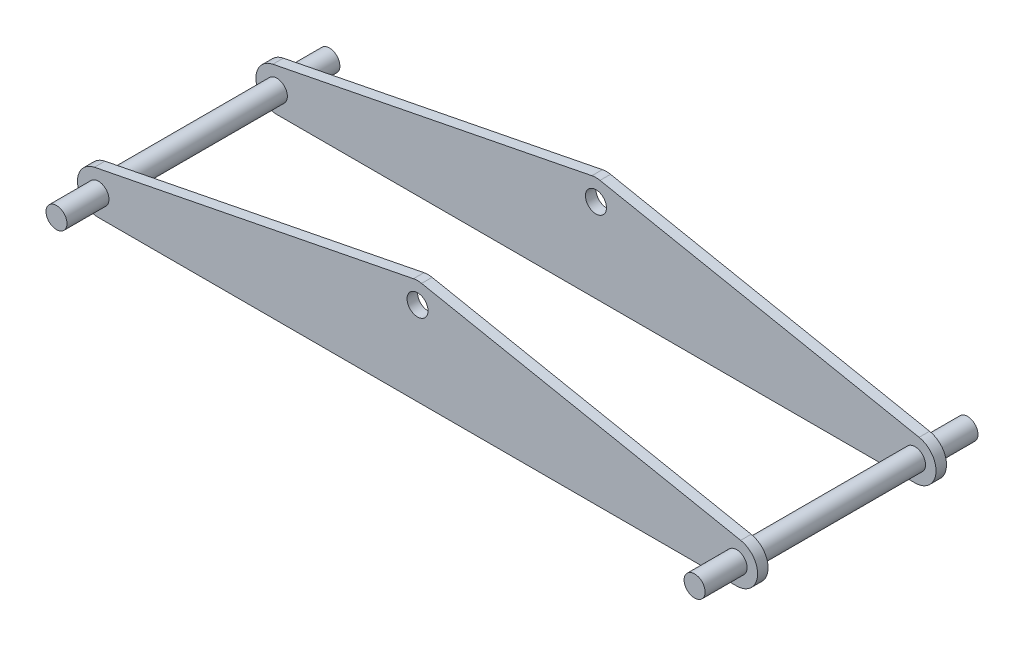
ISO-10303-21;
HEADER;
FILE_DESCRIPTION(('STEP AP214'),'2;1');
FILE_NAME('part.step','',(''),(''),'','','');
FILE_SCHEMA(('AUTOMOTIVE_DESIGN { 1 0 10303 214 1 1 1 1 }'));
ENDSEC;
DATA;
#1=APPLICATION_CONTEXT('core data for automotive mechanical design processes');
#2=APPLICATION_PROTOCOL_DEFINITION('international standard','automotive_design',2000,#1);
#3=PRODUCT_CONTEXT('',#1,'mechanical');
#4=PRODUCT('Part','Part','',(#3));
#5=PRODUCT_RELATED_PRODUCT_CATEGORY('part','',(#4));
#6=PRODUCT_DEFINITION_FORMATION('','',#4);
#7=PRODUCT_DEFINITION_CONTEXT('part definition',#1,'design');
#8=PRODUCT_DEFINITION('design','',#6,#7);
#9=PRODUCT_DEFINITION_SHAPE('','',#8);
#10=(LENGTH_UNIT() NAMED_UNIT(*) SI_UNIT(.MILLI.,.METRE.));
#11=(NAMED_UNIT(*) PLANE_ANGLE_UNIT() SI_UNIT($,.RADIAN.));
#12=(NAMED_UNIT(*) SI_UNIT($,.STERADIAN.) SOLID_ANGLE_UNIT());
#13=UNCERTAINTY_MEASURE_WITH_UNIT(LENGTH_MEASURE(1.E-05),#10,'distance_accuracy_value','');
#14=(GEOMETRIC_REPRESENTATION_CONTEXT(3) GLOBAL_UNCERTAINTY_ASSIGNED_CONTEXT((#13)) GLOBAL_UNIT_ASSIGNED_CONTEXT((#10,
#11,#12)) REPRESENTATION_CONTEXT('',''));
#15=CARTESIAN_POINT('',(0.,0.,0.));
#16=DIRECTION('',(0.,0.,1.));
#17=DIRECTION('',(1.,0.,0.));
#18=AXIS2_PLACEMENT_3D('',#15,#16,#17);
#19=CARTESIAN_POINT('',(-965.2,0.,-555.625));
#20=DIRECTION('',(0.,0.,-1.));
#21=DIRECTION('',(-1.,0.,0.));
#22=AXIS2_PLACEMENT_3D('',#19,#20,#21);
#23=PLANE('',#22);
#24=CARTESIAN_POINT('',(-965.2,0.,-555.625));
#25=DIRECTION('',(0.,0.,-1.));
#26=DIRECTION('',(-1.,0.,0.));
#27=AXIS2_PLACEMENT_3D('',#24,#25,#26);
#28=CIRCLE('',#27,31.75);
#29=CARTESIAN_POINT('',(-996.95,0.,-555.625));
#30=VERTEX_POINT('',#29);
#31=EDGE_CURVE('E193',#30,#30,#28,.T.);
#32=ORIENTED_EDGE('',*,*,#31,.F.);
#33=EDGE_LOOP('',(#32));
#34=FACE_BOUND('',#33,.T.);
#35=CARTESIAN_POINT('',(-965.2,0.,-555.625));
#36=DIRECTION('',(0.,0.,-1.));
#37=DIRECTION('',(-1.,0.,0.));
#38=AXIS2_PLACEMENT_3D('',#35,#36,#37);
#39=CIRCLE('',#38,63.5);
#40=CARTESIAN_POINT('',(-965.2,-63.5,-555.625));
#41=VERTEX_POINT('',#40);
#42=CARTESIAN_POINT('',(-977.495697525438,62.2982007955522,-555.625));
#43=VERTEX_POINT('',#42);
#44=EDGE_CURVE('E138',#41,#43,#39,.T.);
#45=ORIENTED_EDGE('',*,*,#44,.T.);
#46=DIRECTION('',(0.981074028276412,0.193633031896661,0.));
#47=VECTOR('',#46,1.);
#48=CARTESIAN_POINT('',(-977.495697525438,62.2982007955522,-555.625));
#49=LINE('',#48,#47);
#50=CARTESIAN_POINT('',(-12.2956975254381,252.798200795553,-555.625));
#51=VERTEX_POINT('',#50);
#52=EDGE_CURVE('E96',#43,#51,#49,.T.);
#53=ORIENTED_EDGE('',*,*,#52,.T.);
#54=CARTESIAN_POINT('',(-2.09296820237771E-12,190.5,-555.625));
#55=DIRECTION('',(0.,0.,-1.));
#56=DIRECTION('',(-1.,0.,0.));
#57=AXIS2_PLACEMENT_3D('',#54,#55,#56);
#58=CIRCLE('',#57,63.5000000000002);
#59=CARTESIAN_POINT('',(12.2956975254379,252.798200795552,-555.625));
#60=VERTEX_POINT('',#59);
#61=EDGE_CURVE('E109',#51,#60,#58,.T.);
#62=ORIENTED_EDGE('',*,*,#61,.T.);
#63=DIRECTION('',(0.981074028276413,-0.19363303189666,0.));
#64=VECTOR('',#63,1.);
#65=CARTESIAN_POINT('',(12.2956975254379,252.798200795552,-555.625));
#66=LINE('',#65,#64);
#67=CARTESIAN_POINT('',(977.495697525438,62.2982007955522,-555.625));
#68=VERTEX_POINT('',#67);
#69=EDGE_CURVE('E103',#60,#68,#66,.T.);
#70=ORIENTED_EDGE('',*,*,#69,.T.);
#71=CARTESIAN_POINT('',(965.2,0.,-555.625));
#72=DIRECTION('',(0.,0.,-1.));
#73=DIRECTION('',(-1.,0.,0.));
#74=AXIS2_PLACEMENT_3D('',#71,#72,#73);
#75=CIRCLE('',#74,63.5);
#76=CARTESIAN_POINT('',(965.2,-63.5,-555.625));
#77=VERTEX_POINT('',#76);
#78=EDGE_CURVE('E107',#68,#77,#75,.T.);
#79=ORIENTED_EDGE('',*,*,#78,.T.);
#80=DIRECTION('',(-1.,0.,0.));
#81=VECTOR('',#80,1.);
#82=CARTESIAN_POINT('',(965.2,-63.5,-555.625));
#83=LINE('',#82,#81);
#84=EDGE_CURVE('E59',#77,#41,#83,.T.);
#85=ORIENTED_EDGE('',*,*,#84,.T.);
#86=EDGE_LOOP('',(#45,#53,#62,#70,#79,#85));
#87=FACE_BOUND('',#86,.T.);
#88=CARTESIAN_POINT('',(0.,190.5,-555.625));
#89=DIRECTION('',(0.,0.,-1.));
#90=DIRECTION('',(-1.,0.,0.));
#91=AXIS2_PLACEMENT_3D('',#88,#89,#90);
#92=CIRCLE('',#91,31.75);
#93=CARTESIAN_POINT('',(-31.75,190.5,-555.625));
#94=VERTEX_POINT('',#93);
#95=EDGE_CURVE('E131',#94,#94,#92,.T.);
#96=ORIENTED_EDGE('',*,*,#95,.F.);
#97=EDGE_LOOP('',(#96));
#98=FACE_BOUND('',#97,.T.);
#99=CARTESIAN_POINT('',(965.2,0.,-555.625));
#100=DIRECTION('',(0.,0.,-1.));
#101=DIRECTION('',(-1.,0.,0.));
#102=AXIS2_PLACEMENT_3D('',#99,#100,#101);
#103=CIRCLE('',#102,31.75);
#104=CARTESIAN_POINT('',(933.45,0.,-555.625));
#105=VERTEX_POINT('',#104);
#106=EDGE_CURVE('E184',#105,#105,#103,.T.);
#107=ORIENTED_EDGE('',*,*,#106,.F.);
#108=EDGE_LOOP('',(#107));
#109=FACE_BOUND('',#108,.T.);
#110=ADVANCED_FACE('F42',(#34,#87,#98,#109),#23,.T.);
#111=CARTESIAN_POINT('',(-965.2,0.,-523.875));
#112=DIRECTION('',(0.,0.,-1.));
#113=DIRECTION('',(-1.,0.,0.));
#114=AXIS2_PLACEMENT_3D('',#111,#112,#113);
#115=PLANE('',#114);
#116=CARTESIAN_POINT('',(-965.2,0.,-523.875));
#117=DIRECTION('',(0.,0.,-1.));
#118=DIRECTION('',(-1.,0.,0.));
#119=AXIS2_PLACEMENT_3D('',#116,#117,#118);
#120=CIRCLE('',#119,63.5);
#121=CARTESIAN_POINT('',(-965.2,-63.5,-523.875));
#122=VERTEX_POINT('',#121);
#123=CARTESIAN_POINT('',(-977.495697525438,62.2982007955522,-523.875));
#124=VERTEX_POINT('',#123);
#125=EDGE_CURVE('E127',#122,#124,#120,.T.);
#126=ORIENTED_EDGE('',*,*,#125,.F.);
#127=DIRECTION('',(-1.,0.,0.));
#128=VECTOR('',#127,1.);
#129=CARTESIAN_POINT('',(965.2,-63.5,-523.875));
#130=LINE('',#129,#128);
#131=CARTESIAN_POINT('',(965.2,-63.5,-523.875));
#132=VERTEX_POINT('',#131);
#133=EDGE_CURVE('E88',#132,#122,#130,.T.);
#134=ORIENTED_EDGE('',*,*,#133,.F.);
#135=CARTESIAN_POINT('',(965.2,0.,-523.875));
#136=DIRECTION('',(0.,0.,-1.));
#137=DIRECTION('',(-1.,0.,0.));
#138=AXIS2_PLACEMENT_3D('',#135,#136,#137);
#139=CIRCLE('',#138,63.5);
#140=CARTESIAN_POINT('',(977.495697525438,62.2982007955522,-523.875));
#141=VERTEX_POINT('',#140);
#142=EDGE_CURVE('E82',#141,#132,#139,.T.);
#143=ORIENTED_EDGE('',*,*,#142,.F.);
#144=DIRECTION('',(0.981074028276413,-0.19363303189666,0.));
#145=VECTOR('',#144,1.);
#146=CARTESIAN_POINT('',(12.2956975254379,252.798200795552,-523.875));
#147=LINE('',#146,#145);
#148=CARTESIAN_POINT('',(12.2956975254379,252.798200795552,-523.875));
#149=VERTEX_POINT('',#148);
#150=EDGE_CURVE('E117',#149,#141,#147,.T.);
#151=ORIENTED_EDGE('',*,*,#150,.F.);
#152=CARTESIAN_POINT('',(-2.09296820237771E-12,190.5,-523.875));
#153=DIRECTION('',(0.,0.,-1.));
#154=DIRECTION('',(-1.,0.,0.));
#155=AXIS2_PLACEMENT_3D('',#152,#153,#154);
#156=CIRCLE('',#155,63.5000000000002);
#157=CARTESIAN_POINT('',(-12.2956975254381,252.798200795553,-523.875));
#158=VERTEX_POINT('',#157);
#159=EDGE_CURVE('E133',#158,#149,#156,.T.);
#160=ORIENTED_EDGE('',*,*,#159,.F.);
#161=DIRECTION('',(0.981074028276412,0.193633031896661,0.));
#162=VECTOR('',#161,1.);
#163=CARTESIAN_POINT('',(-977.495697525438,62.2982007955522,-523.875));
#164=LINE('',#163,#162);
#165=EDGE_CURVE('E130',#124,#158,#164,.T.);
#166=ORIENTED_EDGE('',*,*,#165,.F.);
#167=EDGE_LOOP('',(#126,#134,#143,#151,#160,#166));
#168=FACE_BOUND('',#167,.T.);
#169=CARTESIAN_POINT('',(0.,190.5,-523.875));
#170=DIRECTION('',(0.,0.,-1.));
#171=DIRECTION('',(-1.,0.,0.));
#172=AXIS2_PLACEMENT_3D('',#169,#170,#171);
#173=CIRCLE('',#172,31.75);
#174=CARTESIAN_POINT('',(-31.75,190.5,-523.875));
#175=VERTEX_POINT('',#174);
#176=EDGE_CURVE('E196',#175,#175,#173,.T.);
#177=ORIENTED_EDGE('',*,*,#176,.T.);
#178=EDGE_LOOP('',(#177));
#179=FACE_BOUND('',#178,.T.);
#180=CARTESIAN_POINT('',(-965.2,0.,-523.875));
#181=DIRECTION('',(0.,0.,-1.));
#182=DIRECTION('',(-1.,0.,0.));
#183=AXIS2_PLACEMENT_3D('',#180,#181,#182);
#184=CIRCLE('',#183,31.75);
#185=CARTESIAN_POINT('',(-996.95,0.,-523.875));
#186=VERTEX_POINT('',#185);
#187=EDGE_CURVE('E190',#186,#186,#184,.T.);
#188=ORIENTED_EDGE('',*,*,#187,.T.);
#189=EDGE_LOOP('',(#188));
#190=FACE_BOUND('',#189,.T.);
#191=CARTESIAN_POINT('',(965.2,0.,-523.875));
#192=DIRECTION('',(0.,0.,-1.));
#193=DIRECTION('',(-1.,0.,0.));
#194=AXIS2_PLACEMENT_3D('',#191,#192,#193);
#195=CIRCLE('',#194,31.75);
#196=CARTESIAN_POINT('',(933.45,0.,-523.875));
#197=VERTEX_POINT('',#196);
#198=EDGE_CURVE('E187',#197,#197,#195,.T.);
#199=ORIENTED_EDGE('',*,*,#198,.T.);
#200=EDGE_LOOP('',(#199));
#201=FACE_BOUND('',#200,.T.);
#202=ADVANCED_FACE('F147',(#168,#179,#190,#201),#115,.F.);
#203=CARTESIAN_POINT('',(-965.2,0.,-555.625));
#204=DIRECTION('',(0.,0.,1.));
#205=DIRECTION('',(1.,0.,0.));
#206=AXIS2_PLACEMENT_3D('',#203,#204,#205);
#207=CYLINDRICAL_SURFACE('',#206,63.5);
#208=ORIENTED_EDGE('',*,*,#125,.T.);
#209=DIRECTION('',(0.,0.,1.));
#210=VECTOR('',#209,1.);
#211=CARTESIAN_POINT('',(-977.495697525438,62.2982007955522,-555.625));
#212=LINE('',#211,#210);
#213=EDGE_CURVE('E12',#43,#124,#212,.T.);
#214=ORIENTED_EDGE('',*,*,#213,.F.);
#215=ORIENTED_EDGE('',*,*,#44,.F.);
#216=DIRECTION('',(0.,0.,1.));
#217=VECTOR('',#216,1.);
#218=CARTESIAN_POINT('',(-965.2,-63.5,-555.625));
#219=LINE('',#218,#217);
#220=EDGE_CURVE('E123',#41,#122,#219,.T.);
#221=ORIENTED_EDGE('',*,*,#220,.T.);
#222=EDGE_LOOP('',(#208,#214,#215,#221));
#223=FACE_BOUND('',#222,.T.);
#224=ADVANCED_FACE('F44',(#223),#207,.T.);
#225=CARTESIAN_POINT('',(-977.495697525438,62.2982007955522,-555.625));
#226=DIRECTION('',(0.193633031896661,-0.981074028276412,0.));
#227=DIRECTION('',(0.981074028276413,0.193633031896661,0.));
#228=AXIS2_PLACEMENT_3D('',#225,#226,#227);
#229=PLANE('',#228);
#230=ORIENTED_EDGE('',*,*,#165,.T.);
#231=DIRECTION('',(0.,0.,1.));
#232=VECTOR('',#231,1.);
#233=CARTESIAN_POINT('',(-12.2956975254381,252.798200795553,-555.625));
#234=LINE('',#233,#232);
#235=EDGE_CURVE('E51',#51,#158,#234,.T.);
#236=ORIENTED_EDGE('',*,*,#235,.F.);
#237=ORIENTED_EDGE('',*,*,#52,.F.);
#238=ORIENTED_EDGE('',*,*,#213,.T.);
#239=EDGE_LOOP('',(#230,#236,#237,#238));
#240=FACE_BOUND('',#239,.T.);
#241=ADVANCED_FACE('F246',(#240),#229,.F.);
#242=CARTESIAN_POINT('',(-2.09296820237771E-12,190.5,-555.625));
#243=DIRECTION('',(0.,0.,1.));
#244=DIRECTION('',(1.,0.,0.));
#245=AXIS2_PLACEMENT_3D('',#242,#243,#244);
#246=CYLINDRICAL_SURFACE('',#245,63.5000000000002);
#247=ORIENTED_EDGE('',*,*,#159,.T.);
#248=DIRECTION('',(0.,0.,1.));
#249=VECTOR('',#248,1.);
#250=CARTESIAN_POINT('',(12.2956975254379,252.798200795552,-555.625));
#251=LINE('',#250,#249);
#252=EDGE_CURVE('E118',#60,#149,#251,.T.);
#253=ORIENTED_EDGE('',*,*,#252,.F.);
#254=ORIENTED_EDGE('',*,*,#61,.F.);
#255=ORIENTED_EDGE('',*,*,#235,.T.);
#256=EDGE_LOOP('',(#247,#253,#254,#255));
#257=FACE_BOUND('',#256,.T.);
#258=ADVANCED_FACE('F144',(#257),#246,.T.);
#259=CARTESIAN_POINT('',(12.2956975254379,252.798200795552,-555.625));
#260=DIRECTION('',(-0.19363303189666,-0.981074028276412,0.));
#261=DIRECTION('',(0.981074028276413,-0.19363303189666,0.));
#262=AXIS2_PLACEMENT_3D('',#259,#260,#261);
#263=PLANE('',#262);
#264=ORIENTED_EDGE('',*,*,#150,.T.);
#265=DIRECTION('',(0.,0.,1.));
#266=VECTOR('',#265,1.);
#267=CARTESIAN_POINT('',(977.495697525438,62.2982007955522,-555.625));
#268=LINE('',#267,#266);
#269=EDGE_CURVE('E114',#68,#141,#268,.T.);
#270=ORIENTED_EDGE('',*,*,#269,.F.);
#271=ORIENTED_EDGE('',*,*,#69,.F.);
#272=ORIENTED_EDGE('',*,*,#252,.T.);
#273=EDGE_LOOP('',(#264,#270,#271,#272));
#274=FACE_BOUND('',#273,.T.);
#275=ADVANCED_FACE('F115',(#274),#263,.F.);
#276=CARTESIAN_POINT('',(965.2,0.,-555.625));
#277=DIRECTION('',(0.,0.,1.));
#278=DIRECTION('',(1.,0.,0.));
#279=AXIS2_PLACEMENT_3D('',#276,#277,#278);
#280=CYLINDRICAL_SURFACE('',#279,63.5);
#281=ORIENTED_EDGE('',*,*,#142,.T.);
#282=DIRECTION('',(0.,0.,1.));
#283=VECTOR('',#282,1.);
#284=CARTESIAN_POINT('',(965.2,-63.5,-555.625));
#285=LINE('',#284,#283);
#286=EDGE_CURVE('E119',#77,#132,#285,.T.);
#287=ORIENTED_EDGE('',*,*,#286,.F.);
#288=ORIENTED_EDGE('',*,*,#78,.F.);
#289=ORIENTED_EDGE('',*,*,#269,.T.);
#290=EDGE_LOOP('',(#281,#287,#288,#289));
#291=FACE_BOUND('',#290,.T.);
#292=ADVANCED_FACE('F121',(#291),#280,.T.);
#293=CARTESIAN_POINT('',(965.2,-63.5,-555.625));
#294=DIRECTION('',(0.,1.,0.));
#295=DIRECTION('',(0.,0.,1.));
#296=AXIS2_PLACEMENT_3D('',#293,#294,#295);
#297=PLANE('',#296);
#298=ORIENTED_EDGE('',*,*,#133,.T.);
#299=ORIENTED_EDGE('',*,*,#220,.F.);
#300=ORIENTED_EDGE('',*,*,#84,.F.);
#301=ORIENTED_EDGE('',*,*,#286,.T.);
#302=EDGE_LOOP('',(#298,#299,#300,#301));
#303=FACE_BOUND('',#302,.T.);
#304=ADVANCED_FACE('F152',(#303),#297,.F.);
#305=CARTESIAN_POINT('',(0.,190.5,-555.625));
#306=DIRECTION('',(0.,0.,1.));
#307=DIRECTION('',(1.,0.,0.));
#308=AXIS2_PLACEMENT_3D('',#305,#306,#307);
#309=CYLINDRICAL_SURFACE('',#308,31.75);
#310=ORIENTED_EDGE('',*,*,#95,.T.);
#311=EDGE_LOOP('',(#310));
#312=FACE_BOUND('',#311,.T.);
#313=ORIENTED_EDGE('',*,*,#176,.F.);
#314=EDGE_LOOP('',(#313));
#315=FACE_BOUND('',#314,.T.);
#316=ADVANCED_FACE('F154',(#312,#315),#309,.F.);
#317=CARTESIAN_POINT('',(-965.2,0.,-555.625));
#318=DIRECTION('',(0.,0.,1.));
#319=DIRECTION('',(1.,0.,0.));
#320=AXIS2_PLACEMENT_3D('',#317,#318,#319);
#321=CYLINDRICAL_SURFACE('',#320,31.75);
#322=ORIENTED_EDGE('',*,*,#31,.T.);
#323=EDGE_LOOP('',(#322));
#324=FACE_BOUND('',#323,.T.);
#325=ORIENTED_EDGE('',*,*,#187,.F.);
#326=EDGE_LOOP('',(#325));
#327=FACE_BOUND('',#326,.T.);
#328=ADVANCED_FACE('F160',(#324,#327),#321,.F.);
#329=CARTESIAN_POINT('',(965.2,0.,-555.625));
#330=DIRECTION('',(0.,0.,1.));
#331=DIRECTION('',(1.,0.,0.));
#332=AXIS2_PLACEMENT_3D('',#329,#330,#331);
#333=CYLINDRICAL_SURFACE('',#332,31.75);
#334=ORIENTED_EDGE('',*,*,#106,.T.);
#335=EDGE_LOOP('',(#334));
#336=FACE_BOUND('',#335,.T.);
#337=ORIENTED_EDGE('',*,*,#198,.F.);
#338=EDGE_LOOP('',(#337));
#339=FACE_BOUND('',#338,.T.);
#340=ADVANCED_FACE('F175',(#336,#339),#333,.F.);
#341=CLOSED_SHELL('',(#110,#202,#224,#241,#258,#275,#292,#304,#316,#328,#340));
#342=MANIFOLD_SOLID_BREP('B2',#341);
#343=CARTESIAN_POINT('',(-965.2,0.,15.875));
#344=DIRECTION('',(0.,0.,1.));
#345=DIRECTION('',(1.,0.,0.));
#346=AXIS2_PLACEMENT_3D('',#343,#344,#345);
#347=PLANE('',#346);
#348=CARTESIAN_POINT('',(-965.2,0.,15.875));
#349=DIRECTION('',(0.,0.,1.));
#350=DIRECTION('',(1.,0.,0.));
#351=AXIS2_PLACEMENT_3D('',#348,#349,#350);
#352=CIRCLE('',#351,31.75);
#353=CARTESIAN_POINT('',(-933.45,0.,15.875));
#354=VERTEX_POINT('',#353);
#355=EDGE_CURVE('E464',#354,#354,#352,.T.);
#356=ORIENTED_EDGE('',*,*,#355,.F.);
#357=EDGE_LOOP('',(#356));
#358=FACE_BOUND('',#357,.T.);
#359=CARTESIAN_POINT('',(-965.2,0.,15.875));
#360=DIRECTION('',(0.,0.,1.));
#361=DIRECTION('',(1.,0.,0.));
#362=AXIS2_PLACEMENT_3D('',#359,#360,#361);
#363=CIRCLE('',#362,63.5);
#364=CARTESIAN_POINT('',(-977.495697525438,62.2982007955522,15.875));
#365=VERTEX_POINT('',#364);
#366=CARTESIAN_POINT('',(-965.2,-63.5,15.875));
#367=VERTEX_POINT('',#366);
#368=EDGE_CURVE('E376',#365,#367,#363,.T.);
#369=ORIENTED_EDGE('',*,*,#368,.T.);
#370=DIRECTION('',(1.,0.,0.));
#371=VECTOR('',#370,1.);
#372=CARTESIAN_POINT('',(-965.2,-63.5,15.875));
#373=LINE('',#372,#371);
#374=CARTESIAN_POINT('',(965.2,-63.5,15.875));
#375=VERTEX_POINT('',#374);
#376=EDGE_CURVE('E334',#367,#375,#373,.T.);
#377=ORIENTED_EDGE('',*,*,#376,.T.);
#378=CARTESIAN_POINT('',(965.2,0.,15.875));
#379=DIRECTION('',(0.,0.,1.));
#380=DIRECTION('',(-1.,0.,0.));
#381=AXIS2_PLACEMENT_3D('',#378,#379,#380);
#382=CIRCLE('',#381,63.5);
#383=CARTESIAN_POINT('',(977.495697525438,62.2982007955522,15.875));
#384=VERTEX_POINT('',#383);
#385=EDGE_CURVE('E347',#375,#384,#382,.T.);
#386=ORIENTED_EDGE('',*,*,#385,.T.);
#387=DIRECTION('',(-0.981074028276413,0.19363303189666,0.));
#388=VECTOR('',#387,1.);
#389=CARTESIAN_POINT('',(977.495697525438,62.2982007955522,15.875));
#390=LINE('',#389,#388);
#391=CARTESIAN_POINT('',(12.2956975254379,252.798200795552,15.875));
#392=VERTEX_POINT('',#391);
#393=EDGE_CURVE('E341',#384,#392,#390,.T.);
#394=ORIENTED_EDGE('',*,*,#393,.T.);
#395=CARTESIAN_POINT('',(-2.09296820237771E-12,190.5,15.875));
#396=DIRECTION('',(0.,0.,1.));
#397=DIRECTION('',(1.,0.,0.));
#398=AXIS2_PLACEMENT_3D('',#395,#396,#397);
#399=CIRCLE('',#398,63.5000000000001);
#400=CARTESIAN_POINT('',(-12.295697525438,252.798200795552,15.875));
#401=VERTEX_POINT('',#400);
#402=EDGE_CURVE('E345',#392,#401,#399,.T.);
#403=ORIENTED_EDGE('',*,*,#402,.T.);
#404=DIRECTION('',(-0.981074028276413,-0.19363303189666,0.));
#405=VECTOR('',#404,1.);
#406=CARTESIAN_POINT('',(-977.495697525438,62.2982007955522,15.875));
#407=LINE('',#406,#405);
#408=EDGE_CURVE('E297',#401,#365,#407,.T.);
#409=ORIENTED_EDGE('',*,*,#408,.T.);
#410=EDGE_LOOP('',(#369,#377,#386,#394,#403,#409));
#411=FACE_BOUND('',#410,.T.);
#412=CARTESIAN_POINT('',(0.,190.5,15.875));
#413=DIRECTION('',(0.,0.,1.));
#414=DIRECTION('',(1.,0.,0.));
#415=AXIS2_PLACEMENT_3D('',#412,#413,#414);
#416=CIRCLE('',#415,31.75);
#417=CARTESIAN_POINT('',(31.75,190.5,15.875));
#418=VERTEX_POINT('',#417);
#419=EDGE_CURVE('E369',#418,#418,#416,.T.);
#420=ORIENTED_EDGE('',*,*,#419,.F.);
#421=EDGE_LOOP('',(#420));
#422=FACE_BOUND('',#421,.T.);
#423=CARTESIAN_POINT('',(965.2,0.,15.875));
#424=DIRECTION('',(0.,0.,1.));
#425=DIRECTION('',(-1.,0.,0.));
#426=AXIS2_PLACEMENT_3D('',#423,#424,#425);
#427=CIRCLE('',#426,31.75);
#428=CARTESIAN_POINT('',(933.45,0.,15.875));
#429=VERTEX_POINT('',#428);
#430=EDGE_CURVE('E442',#429,#429,#427,.T.);
#431=ORIENTED_EDGE('',*,*,#430,.F.);
#432=EDGE_LOOP('',(#431));
#433=FACE_BOUND('',#432,.T.);
#434=ADVANCED_FACE('F280',(#358,#411,#422,#433),#347,.T.);
#435=CARTESIAN_POINT('',(-965.2,0.,-15.875));
#436=DIRECTION('',(0.,0.,1.));
#437=DIRECTION('',(1.,0.,0.));
#438=AXIS2_PLACEMENT_3D('',#435,#436,#437);
#439=PLANE('',#438);
#440=CARTESIAN_POINT('',(-965.2,0.,-15.875));
#441=DIRECTION('',(0.,0.,1.));
#442=DIRECTION('',(1.,0.,0.));
#443=AXIS2_PLACEMENT_3D('',#440,#441,#442);
#444=CIRCLE('',#443,63.5);
#445=CARTESIAN_POINT('',(-977.495697525438,62.2982007955522,-15.875));
#446=VERTEX_POINT('',#445);
#447=CARTESIAN_POINT('',(-965.2,-63.5,-15.875));
#448=VERTEX_POINT('',#447);
#449=EDGE_CURVE('E365',#446,#448,#444,.T.);
#450=ORIENTED_EDGE('',*,*,#449,.F.);
#451=DIRECTION('',(-0.981074028276413,-0.19363303189666,0.));
#452=VECTOR('',#451,1.);
#453=CARTESIAN_POINT('',(-977.495697525438,62.2982007955522,-15.875));
#454=LINE('',#453,#452);
#455=CARTESIAN_POINT('',(-12.295697525438,252.798200795552,-15.875));
#456=VERTEX_POINT('',#455);
#457=EDGE_CURVE('E326',#456,#446,#454,.T.);
#458=ORIENTED_EDGE('',*,*,#457,.F.);
#459=CARTESIAN_POINT('',(-2.09296820237771E-12,190.5,-15.875));
#460=DIRECTION('',(0.,0.,1.));
#461=DIRECTION('',(1.,0.,0.));
#462=AXIS2_PLACEMENT_3D('',#459,#460,#461);
#463=CIRCLE('',#462,63.5000000000001);
#464=CARTESIAN_POINT('',(12.2956975254379,252.798200795552,-15.875));
#465=VERTEX_POINT('',#464);
#466=EDGE_CURVE('E320',#465,#456,#463,.T.);
#467=ORIENTED_EDGE('',*,*,#466,.F.);
#468=DIRECTION('',(-0.981074028276413,0.19363303189666,0.));
#469=VECTOR('',#468,1.);
#470=CARTESIAN_POINT('',(977.495697525438,62.2982007955522,-15.875));
#471=LINE('',#470,#469);
#472=CARTESIAN_POINT('',(977.495697525438,62.2982007955522,-15.875));
#473=VERTEX_POINT('',#472);
#474=EDGE_CURVE('E355',#473,#465,#471,.T.);
#475=ORIENTED_EDGE('',*,*,#474,.F.);
#476=CARTESIAN_POINT('',(965.2,0.,-15.875));
#477=DIRECTION('',(0.,0.,1.));
#478=DIRECTION('',(-1.,0.,0.));
#479=AXIS2_PLACEMENT_3D('',#476,#477,#478);
#480=CIRCLE('',#479,63.5);
#481=CARTESIAN_POINT('',(965.2,-63.5,-15.875));
#482=VERTEX_POINT('',#481);
#483=EDGE_CURVE('E371',#482,#473,#480,.T.);
#484=ORIENTED_EDGE('',*,*,#483,.F.);
#485=DIRECTION('',(1.,0.,0.));
#486=VECTOR('',#485,1.);
#487=CARTESIAN_POINT('',(-965.2,-63.5,-15.875));
#488=LINE('',#487,#486);
#489=EDGE_CURVE('E368',#448,#482,#488,.T.);
#490=ORIENTED_EDGE('',*,*,#489,.F.);
#491=EDGE_LOOP('',(#450,#458,#467,#475,#484,#490));
#492=FACE_BOUND('',#491,.T.);
#493=CARTESIAN_POINT('',(0.,190.5,-15.875));
#494=DIRECTION('',(0.,0.,1.));
#495=DIRECTION('',(1.,0.,0.));
#496=AXIS2_PLACEMENT_3D('',#493,#494,#495);
#497=CIRCLE('',#496,31.75);
#498=CARTESIAN_POINT('',(31.75,190.5,-15.875));
#499=VERTEX_POINT('',#498);
#500=EDGE_CURVE('E467',#499,#499,#497,.T.);
#501=ORIENTED_EDGE('',*,*,#500,.T.);
#502=EDGE_LOOP('',(#501));
#503=FACE_BOUND('',#502,.T.);
#504=CARTESIAN_POINT('',(-965.2,0.,-15.875));
#505=DIRECTION('',(0.,0.,1.));
#506=DIRECTION('',(1.,0.,0.));
#507=AXIS2_PLACEMENT_3D('',#504,#505,#506);
#508=CIRCLE('',#507,31.75);
#509=CARTESIAN_POINT('',(-933.45,0.,-15.875));
#510=VERTEX_POINT('',#509);
#511=EDGE_CURVE('E460',#510,#510,#508,.F.);
#512=ORIENTED_EDGE('',*,*,#511,.F.);
#513=EDGE_LOOP('',(#512));
#514=FACE_BOUND('',#513,.T.);
#515=CARTESIAN_POINT('',(965.2,0.,-15.875));
#516=DIRECTION('',(0.,0.,1.));
#517=DIRECTION('',(1.,0.,0.));
#518=AXIS2_PLACEMENT_3D('',#515,#516,#517);
#519=CIRCLE('',#518,31.75);
#520=CARTESIAN_POINT('',(996.95,0.,-15.875));
#521=VERTEX_POINT('',#520);
#522=EDGE_CURVE('E446',#521,#521,#519,.F.);
#523=ORIENTED_EDGE('',*,*,#522,.F.);
#524=EDGE_LOOP('',(#523));
#525=FACE_BOUND('',#524,.T.);
#526=ADVANCED_FACE('F385',(#492,#503,#514,#525),#439,.F.);
#527=CARTESIAN_POINT('',(-965.2,0.,15.875));
#528=DIRECTION('',(0.,0.,-1.));
#529=DIRECTION('',(-1.,0.,0.));
#530=AXIS2_PLACEMENT_3D('',#527,#528,#529);
#531=CYLINDRICAL_SURFACE('',#530,63.5);
#532=ORIENTED_EDGE('',*,*,#449,.T.);
#533=DIRECTION('',(0.,0.,-1.));
#534=VECTOR('',#533,1.);
#535=CARTESIAN_POINT('',(-965.2,-63.5,15.875));
#536=LINE('',#535,#534);
#537=EDGE_CURVE('E40',#367,#448,#536,.T.);
#538=ORIENTED_EDGE('',*,*,#537,.F.);
#539=ORIENTED_EDGE('',*,*,#368,.F.);
#540=DIRECTION('',(0.,0.,-1.));
#541=VECTOR('',#540,1.);
#542=CARTESIAN_POINT('',(-977.495697525438,62.2982007955522,15.875));
#543=LINE('',#542,#541);
#544=EDGE_CURVE('E361',#365,#446,#543,.T.);
#545=ORIENTED_EDGE('',*,*,#544,.T.);
#546=EDGE_LOOP('',(#532,#538,#539,#545));
#547=FACE_BOUND('',#546,.T.);
#548=ADVANCED_FACE('F282',(#547),#531,.T.);
#549=CARTESIAN_POINT('',(-965.2,-63.5,15.875));
#550=DIRECTION('',(0.,1.,0.));
#551=DIRECTION('',(0.,0.,1.));
#552=AXIS2_PLACEMENT_3D('',#549,#550,#551);
#553=PLANE('',#552);
#554=ORIENTED_EDGE('',*,*,#489,.T.);
#555=DIRECTION('',(0.,0.,-1.));
#556=VECTOR('',#555,1.);
#557=CARTESIAN_POINT('',(965.2,-63.5,15.875));
#558=LINE('',#557,#556);
#559=EDGE_CURVE('E289',#375,#482,#558,.T.);
#560=ORIENTED_EDGE('',*,*,#559,.F.);
#561=ORIENTED_EDGE('',*,*,#376,.F.);
#562=ORIENTED_EDGE('',*,*,#537,.T.);
#563=EDGE_LOOP('',(#554,#560,#561,#562));
#564=FACE_BOUND('',#563,.T.);
#565=ADVANCED_FACE('F557',(#564),#553,.F.);
#566=CARTESIAN_POINT('',(965.2,0.,15.875));
#567=DIRECTION('',(0.,0.,-1.));
#568=DIRECTION('',(-1.,0.,0.));
#569=AXIS2_PLACEMENT_3D('',#566,#567,#568);
#570=CYLINDRICAL_SURFACE('',#569,63.5);
#571=ORIENTED_EDGE('',*,*,#483,.T.);
#572=DIRECTION('',(0.,0.,-1.));
#573=VECTOR('',#572,1.);
#574=CARTESIAN_POINT('',(977.495697525438,62.2982007955522,15.875));
#575=LINE('',#574,#573);
#576=EDGE_CURVE('E356',#384,#473,#575,.T.);
#577=ORIENTED_EDGE('',*,*,#576,.F.);
#578=ORIENTED_EDGE('',*,*,#385,.F.);
#579=ORIENTED_EDGE('',*,*,#559,.T.);
#580=EDGE_LOOP('',(#571,#577,#578,#579));
#581=FACE_BOUND('',#580,.T.);
#582=ADVANCED_FACE('F382',(#581),#570,.T.);
#583=CARTESIAN_POINT('',(977.495697525438,62.2982007955522,15.875));
#584=DIRECTION('',(-0.19363303189666,-0.981074028276412,0.));
#585=DIRECTION('',(0.981074028276413,-0.19363303189666,0.));
#586=AXIS2_PLACEMENT_3D('',#583,#584,#585);
#587=PLANE('',#586);
#588=ORIENTED_EDGE('',*,*,#474,.T.);
#589=DIRECTION('',(0.,0.,-1.));
#590=VECTOR('',#589,1.);
#591=CARTESIAN_POINT('',(12.2956975254379,252.798200795552,15.875));
#592=LINE('',#591,#590);
#593=EDGE_CURVE('E352',#392,#465,#592,.T.);
#594=ORIENTED_EDGE('',*,*,#593,.F.);
#595=ORIENTED_EDGE('',*,*,#393,.F.);
#596=ORIENTED_EDGE('',*,*,#576,.T.);
#597=EDGE_LOOP('',(#588,#594,#595,#596));
#598=FACE_BOUND('',#597,.T.);
#599=ADVANCED_FACE('F353',(#598),#587,.F.);
#600=CARTESIAN_POINT('',(-2.09296820237771E-12,190.5,15.875));
#601=DIRECTION('',(0.,0.,-1.));
#602=DIRECTION('',(-1.,0.,0.));
#603=AXIS2_PLACEMENT_3D('',#600,#601,#602);
#604=CYLINDRICAL_SURFACE('',#603,63.5000000000001);
#605=ORIENTED_EDGE('',*,*,#466,.T.);
#606=DIRECTION('',(0.,0.,-1.));
#607=VECTOR('',#606,1.);
#608=CARTESIAN_POINT('',(-12.295697525438,252.798200795552,15.875));
#609=LINE('',#608,#607);
#610=EDGE_CURVE('E357',#401,#456,#609,.T.);
#611=ORIENTED_EDGE('',*,*,#610,.F.);
#612=ORIENTED_EDGE('',*,*,#402,.F.);
#613=ORIENTED_EDGE('',*,*,#593,.T.);
#614=EDGE_LOOP('',(#605,#611,#612,#613));
#615=FACE_BOUND('',#614,.T.);
#616=ADVANCED_FACE('F359',(#615),#604,.T.);
#617=CARTESIAN_POINT('',(-977.495697525438,62.2982007955522,15.875));
#618=DIRECTION('',(0.19363303189666,-0.981074028276412,0.));
#619=DIRECTION('',(0.981074028276413,0.19363303189666,0.));
#620=AXIS2_PLACEMENT_3D('',#617,#618,#619);
#621=PLANE('',#620);
#622=ORIENTED_EDGE('',*,*,#457,.T.);
#623=ORIENTED_EDGE('',*,*,#544,.F.);
#624=ORIENTED_EDGE('',*,*,#408,.F.);
#625=ORIENTED_EDGE('',*,*,#610,.T.);
#626=EDGE_LOOP('',(#622,#623,#624,#625));
#627=FACE_BOUND('',#626,.T.);
#628=ADVANCED_FACE('F390',(#627),#621,.F.);
#629=CARTESIAN_POINT('',(0.,190.5,15.875));
#630=DIRECTION('',(0.,0.,-1.));
#631=DIRECTION('',(-1.,0.,0.));
#632=AXIS2_PLACEMENT_3D('',#629,#630,#631);
#633=CYLINDRICAL_SURFACE('',#632,31.75);
#634=ORIENTED_EDGE('',*,*,#419,.T.);
#635=EDGE_LOOP('',(#634));
#636=FACE_BOUND('',#635,.T.);
#637=ORIENTED_EDGE('',*,*,#500,.F.);
#638=EDGE_LOOP('',(#637));
#639=FACE_BOUND('',#638,.T.);
#640=ADVANCED_FACE('F392',(#636,#639),#633,.F.);
#641=CARTESIAN_POINT('',(-965.2,0.,-682.625));
#642=DIRECTION('',(0.,0.,-1.));
#643=DIRECTION('',(-1.,0.,0.));
#644=AXIS2_PLACEMENT_3D('',#641,#642,#643);
#645=PLANE('',#644);
#646=CARTESIAN_POINT('',(-965.2,0.,-682.625));
#647=DIRECTION('',(0.,0.,-1.));
#648=DIRECTION('',(-1.,0.,0.));
#649=AXIS2_PLACEMENT_3D('',#646,#647,#648);
#650=CIRCLE('',#649,31.75);
#651=CARTESIAN_POINT('',(-996.95,0.,-682.625));
#652=VERTEX_POINT('',#651);
#653=EDGE_CURVE('E457',#652,#652,#650,.T.);
#654=ORIENTED_EDGE('',*,*,#653,.T.);
#655=EDGE_LOOP('',(#654));
#656=FACE_BOUND('',#655,.T.);
#657=ADVANCED_FACE('F398',(#656),#645,.T.);
#658=CARTESIAN_POINT('',(-965.2,0.,-682.625));
#659=DIRECTION('',(0.,0.,1.));
#660=DIRECTION('',(1.,0.,0.));
#661=AXIS2_PLACEMENT_3D('',#658,#659,#660);
#662=CYLINDRICAL_SURFACE('',#661,31.75);
#663=ORIENTED_EDGE('',*,*,#653,.F.);
#664=EDGE_LOOP('',(#663));
#665=FACE_BOUND('',#664,.T.);
#666=ORIENTED_EDGE('',*,*,#511,.T.);
#667=EDGE_LOOP('',(#666));
#668=FACE_BOUND('',#667,.T.);
#669=ADVANCED_FACE('F415',(#665,#668),#662,.T.);
#670=ORIENTED_EDGE('',*,*,#355,.T.);
#671=EDGE_LOOP('',(#670));
#672=FACE_BOUND('',#671,.T.);
#673=CARTESIAN_POINT('',(-965.2,0.,142.875));
#674=DIRECTION('',(0.,0.,-1.));
#675=DIRECTION('',(-1.,0.,0.));
#676=AXIS2_PLACEMENT_3D('',#673,#674,#675);
#677=CIRCLE('',#676,31.75);
#678=CARTESIAN_POINT('',(-996.95,0.,142.875));
#679=VERTEX_POINT('',#678);
#680=EDGE_CURVE('E450',#679,#679,#677,.T.);
#681=ORIENTED_EDGE('',*,*,#680,.T.);
#682=EDGE_LOOP('',(#681));
#683=FACE_BOUND('',#682,.T.);
#684=ADVANCED_FACE('F411',(#672,#683),#662,.T.);
#685=CARTESIAN_POINT('',(-965.2,0.,142.875));
#686=DIRECTION('',(0.,0.,-1.));
#687=DIRECTION('',(-1.,0.,0.));
#688=AXIS2_PLACEMENT_3D('',#685,#686,#687);
#689=PLANE('',#688);
#690=ORIENTED_EDGE('',*,*,#680,.F.);
#691=EDGE_LOOP('',(#690));
#692=FACE_BOUND('',#691,.T.);
#693=ADVANCED_FACE('F414',(#692),#689,.F.);
#694=CARTESIAN_POINT('',(965.2,0.,-682.625));
#695=DIRECTION('',(0.,0.,-1.));
#696=DIRECTION('',(-1.,0.,0.));
#697=AXIS2_PLACEMENT_3D('',#694,#695,#696);
#698=PLANE('',#697);
#699=CARTESIAN_POINT('',(965.2,0.,-682.625));
#700=DIRECTION('',(0.,0.,-1.));
#701=DIRECTION('',(-1.,0.,0.));
#702=AXIS2_PLACEMENT_3D('',#699,#700,#701);
#703=CIRCLE('',#702,31.75);
#704=CARTESIAN_POINT('',(933.45,0.,-682.625));
#705=VERTEX_POINT('',#704);
#706=EDGE_CURVE('E447',#705,#705,#703,.T.);
#707=ORIENTED_EDGE('',*,*,#706,.T.);
#708=EDGE_LOOP('',(#707));
#709=FACE_BOUND('',#708,.T.);
#710=ADVANCED_FACE('F422',(#709),#698,.T.);
#711=CARTESIAN_POINT('',(965.2,0.,-682.625));
#712=DIRECTION('',(0.,0.,1.));
#713=DIRECTION('',(1.,0.,0.));
#714=AXIS2_PLACEMENT_3D('',#711,#712,#713);
#715=CYLINDRICAL_SURFACE('',#714,31.75);
#716=ORIENTED_EDGE('',*,*,#706,.F.);
#717=EDGE_LOOP('',(#716));
#718=FACE_BOUND('',#717,.T.);
#719=ORIENTED_EDGE('',*,*,#522,.T.);
#720=EDGE_LOOP('',(#719));
#721=FACE_BOUND('',#720,.T.);
#722=ADVANCED_FACE('F431',(#718,#721),#715,.T.);
#723=ORIENTED_EDGE('',*,*,#430,.T.);
#724=EDGE_LOOP('',(#723));
#725=FACE_BOUND('',#724,.T.);
#726=CARTESIAN_POINT('',(965.2,0.,142.875));
#727=DIRECTION('',(0.,0.,-1.));
#728=DIRECTION('',(-1.,0.,0.));
#729=AXIS2_PLACEMENT_3D('',#726,#727,#728);
#730=CIRCLE('',#729,31.75);
#731=CARTESIAN_POINT('',(933.45,0.,142.875));
#732=VERTEX_POINT('',#731);
#733=EDGE_CURVE('E445',#732,#732,#730,.T.);
#734=ORIENTED_EDGE('',*,*,#733,.T.);
#735=EDGE_LOOP('',(#734));
#736=FACE_BOUND('',#735,.T.);
#737=ADVANCED_FACE('F427',(#725,#736),#715,.T.);
#738=CARTESIAN_POINT('',(965.2,0.,142.875));
#739=DIRECTION('',(0.,0.,-1.));
#740=DIRECTION('',(-1.,0.,0.));
#741=AXIS2_PLACEMENT_3D('',#738,#739,#740);
#742=PLANE('',#741);
#743=ORIENTED_EDGE('',*,*,#733,.F.);
#744=EDGE_LOOP('',(#743));
#745=FACE_BOUND('',#744,.T.);
#746=ADVANCED_FACE('F424',(#745),#742,.F.);
#747=CLOSED_SHELL('',(#434,#526,#548,#565,#582,#599,#616,#628,#640,#657,#669,#684,#693,#710,
#722,#737,#746));
#748=MANIFOLD_SOLID_BREP('B6',#747);
#749=ADVANCED_BREP_SHAPE_REPRESENTATION('',(#18,#342,#748),#14);
#750=SHAPE_DEFINITION_REPRESENTATION(#9,#749);
ENDSEC;
END-ISO-10303-21;
